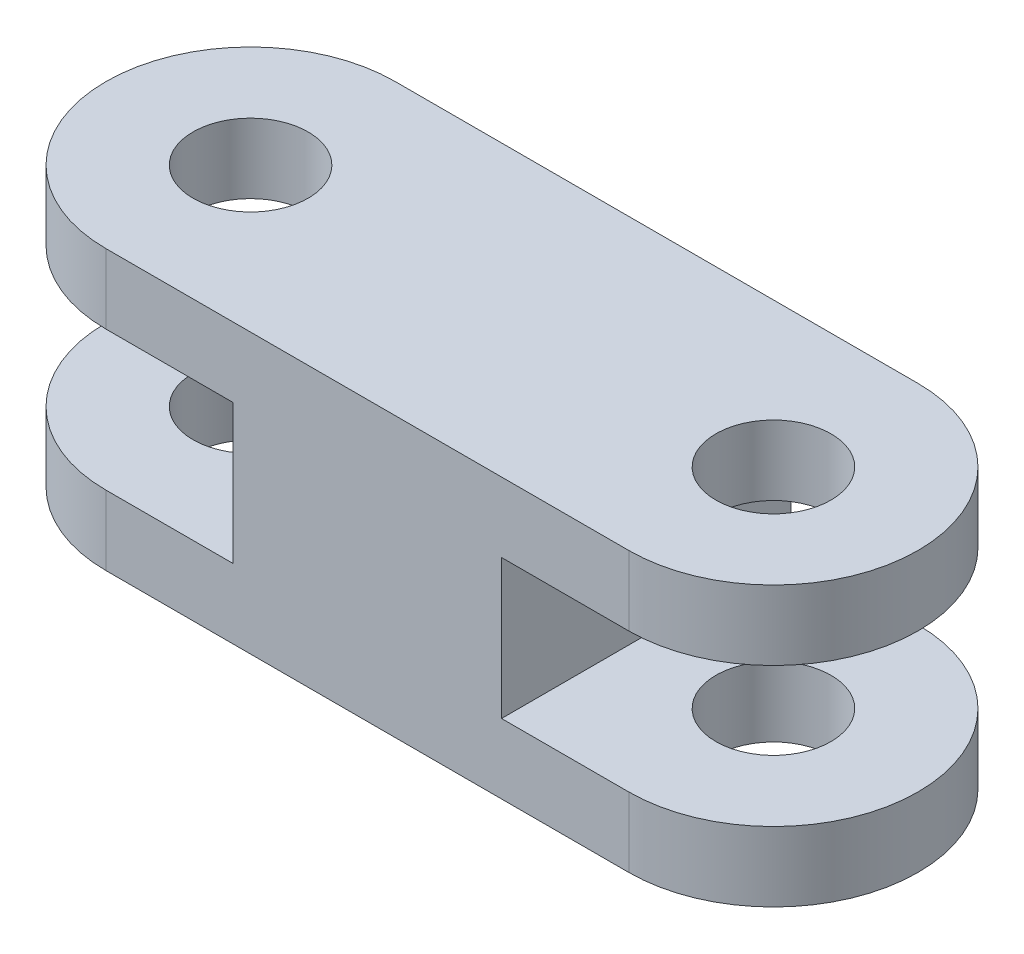
ISO-10303-21;
HEADER;
FILE_DESCRIPTION(('STEP AP214'),'2;1');
FILE_NAME('part.step','',(''),(''),'','','');
FILE_SCHEMA(('AUTOMOTIVE_DESIGN { 1 0 10303 214 1 1 1 1 }'));
ENDSEC;
DATA;
#1=APPLICATION_CONTEXT('core data for automotive mechanical design processes');
#2=APPLICATION_PROTOCOL_DEFINITION('international standard','automotive_design',2000,#1);
#3=PRODUCT_CONTEXT('',#1,'mechanical');
#4=PRODUCT('Part','Part','',(#3));
#5=PRODUCT_RELATED_PRODUCT_CATEGORY('part','',(#4));
#6=PRODUCT_DEFINITION_FORMATION('','',#4);
#7=PRODUCT_DEFINITION_CONTEXT('part definition',#1,'design');
#8=PRODUCT_DEFINITION('design','',#6,#7);
#9=PRODUCT_DEFINITION_SHAPE('','',#8);
#10=(LENGTH_UNIT() NAMED_UNIT(*) SI_UNIT(.MILLI.,.METRE.));
#11=(NAMED_UNIT(*) PLANE_ANGLE_UNIT() SI_UNIT($,.RADIAN.));
#12=(NAMED_UNIT(*) SI_UNIT($,.STERADIAN.) SOLID_ANGLE_UNIT());
#13=UNCERTAINTY_MEASURE_WITH_UNIT(LENGTH_MEASURE(1.E-05),#10,'distance_accuracy_value','');
#14=(GEOMETRIC_REPRESENTATION_CONTEXT(3) GLOBAL_UNCERTAINTY_ASSIGNED_CONTEXT((#13)) GLOBAL_UNIT_ASSIGNED_CONTEXT((#10,
#11,#12)) REPRESENTATION_CONTEXT('',''));
#15=CARTESIAN_POINT('',(0.,0.,0.));
#16=DIRECTION('',(0.,0.,1.));
#17=DIRECTION('',(1.,0.,0.));
#18=AXIS2_PLACEMENT_3D('',#15,#16,#17);
#19=CARTESIAN_POINT('',(-7.5,2.,0.));
#20=DIRECTION('',(0.,1.,0.));
#21=DIRECTION('',(0.,0.,1.));
#22=AXIS2_PLACEMENT_3D('',#19,#20,#21);
#23=PLANE('',#22);
#24=DIRECTION('',(0.,0.,1.));
#25=VECTOR('',#24,1.);
#26=CARTESIAN_POINT('',(-3.85,2.,4.15));
#27=LINE('',#26,#25);
#28=CARTESIAN_POINT('',(-3.85,2.,-4.15));
#29=VERTEX_POINT('',#28);
#30=CARTESIAN_POINT('',(-3.85,2.,4.15));
#31=VERTEX_POINT('',#30);
#32=EDGE_CURVE('E55',#29,#31,#27,.T.);
#33=ORIENTED_EDGE('',*,*,#32,.F.);
#34=DIRECTION('',(-1.,0.,0.));
#35=VECTOR('',#34,1.);
#36=CARTESIAN_POINT('',(-7.5,2.,-4.15));
#37=LINE('',#36,#35);
#38=CARTESIAN_POINT('',(-7.5,2.,-4.15));
#39=VERTEX_POINT('',#38);
#40=EDGE_CURVE('E260',#29,#39,#37,.T.);
#41=ORIENTED_EDGE('',*,*,#40,.T.);
#42=CARTESIAN_POINT('',(-7.5,2.,0.));
#43=DIRECTION('',(0.,1.,0.));
#44=DIRECTION('',(0.,0.,1.));
#45=AXIS2_PLACEMENT_3D('',#42,#43,#44);
#46=CIRCLE('',#45,4.15);
#47=CARTESIAN_POINT('',(-7.5,2.,4.15));
#48=VERTEX_POINT('',#47);
#49=EDGE_CURVE('E248',#39,#48,#46,.T.);
#50=ORIENTED_EDGE('',*,*,#49,.T.);
#51=DIRECTION('',(1.,0.,0.));
#52=VECTOR('',#51,1.);
#53=CARTESIAN_POINT('',(-7.5,2.,4.15));
#54=LINE('',#53,#52);
#55=EDGE_CURVE('E254',#48,#31,#54,.T.);
#56=ORIENTED_EDGE('',*,*,#55,.T.);
#57=EDGE_LOOP('',(#33,#41,#50,#56));
#58=FACE_BOUND('',#57,.T.);
#59=CARTESIAN_POINT('',(-7.5,2.,0.));
#60=DIRECTION('',(0.,1.,0.));
#61=DIRECTION('',(0.,0.,1.));
#62=AXIS2_PLACEMENT_3D('',#59,#60,#61);
#63=CIRCLE('',#62,1.65);
#64=CARTESIAN_POINT('',(-7.5,2.,1.65));
#65=VERTEX_POINT('',#64);
#66=EDGE_CURVE('E240',#65,#65,#63,.T.);
#67=ORIENTED_EDGE('',*,*,#66,.F.);
#68=EDGE_LOOP('',(#67));
#69=FACE_BOUND('',#68,.T.);
#70=ADVANCED_FACE('F39',(#58,#69),#23,.T.);
#71=DIRECTION('',(0.,0.,-1.));
#72=VECTOR('',#71,1.);
#73=CARTESIAN_POINT('',(3.85,2.,4.15));
#74=LINE('',#73,#72);
#75=CARTESIAN_POINT('',(3.85,2.,4.15));
#76=VERTEX_POINT('',#75);
#77=CARTESIAN_POINT('',(3.85,2.,-4.15));
#78=VERTEX_POINT('',#77);
#79=EDGE_CURVE('E63',#76,#78,#74,.T.);
#80=ORIENTED_EDGE('',*,*,#79,.F.);
#81=CARTESIAN_POINT('',(7.5,2.,4.15));
#82=VERTEX_POINT('',#81);
#83=EDGE_CURVE('E252',#76,#82,#54,.T.);
#84=ORIENTED_EDGE('',*,*,#83,.T.);
#85=CARTESIAN_POINT('',(7.5,2.,0.));
#86=DIRECTION('',(0.,1.,0.));
#87=DIRECTION('',(0.,0.,1.));
#88=AXIS2_PLACEMENT_3D('',#85,#86,#87);
#89=CIRCLE('',#88,4.15);
#90=CARTESIAN_POINT('',(7.5,2.,-4.15));
#91=VERTEX_POINT('',#90);
#92=EDGE_CURVE('E257',#82,#91,#89,.T.);
#93=ORIENTED_EDGE('',*,*,#92,.T.);
#94=EDGE_CURVE('E261',#91,#78,#37,.T.);
#95=ORIENTED_EDGE('',*,*,#94,.T.);
#96=EDGE_LOOP('',(#80,#84,#93,#95));
#97=FACE_BOUND('',#96,.T.);
#98=CARTESIAN_POINT('',(7.5,2.,0.));
#99=DIRECTION('',(0.,1.,0.));
#100=DIRECTION('',(0.,0.,1.));
#101=AXIS2_PLACEMENT_3D('',#98,#99,#100);
#102=CIRCLE('',#101,1.65);
#103=CARTESIAN_POINT('',(7.5,2.,1.65));
#104=VERTEX_POINT('',#103);
#105=EDGE_CURVE('E232',#104,#104,#102,.T.);
#106=ORIENTED_EDGE('',*,*,#105,.F.);
#107=EDGE_LOOP('',(#106));
#108=FACE_BOUND('',#107,.T.);
#109=ADVANCED_FACE('F338',(#97,#108),#23,.T.);
#110=CARTESIAN_POINT('',(-7.5,0.,0.));
#111=DIRECTION('',(0.,1.,0.));
#112=DIRECTION('',(0.,0.,1.));
#113=AXIS2_PLACEMENT_3D('',#110,#111,#112);
#114=PLANE('',#113);
#115=CARTESIAN_POINT('',(-7.5,0.,0.));
#116=DIRECTION('',(0.,1.,0.));
#117=DIRECTION('',(0.,0.,1.));
#118=AXIS2_PLACEMENT_3D('',#115,#116,#117);
#119=CIRCLE('',#118,4.15);
#120=CARTESIAN_POINT('',(-7.5,0.,-4.15));
#121=VERTEX_POINT('',#120);
#122=CARTESIAN_POINT('',(-7.5,0.,4.15));
#123=VERTEX_POINT('',#122);
#124=EDGE_CURVE('E244',#121,#123,#119,.T.);
#125=ORIENTED_EDGE('',*,*,#124,.F.);
#126=DIRECTION('',(-1.,0.,0.));
#127=VECTOR('',#126,1.);
#128=CARTESIAN_POINT('',(-7.5,0.,-4.15));
#129=LINE('',#128,#127);
#130=CARTESIAN_POINT('',(7.5,0.,-4.15));
#131=VERTEX_POINT('',#130);
#132=EDGE_CURVE('E253',#131,#121,#129,.T.);
#133=ORIENTED_EDGE('',*,*,#132,.F.);
#134=CARTESIAN_POINT('',(7.5,0.,0.));
#135=DIRECTION('',(0.,1.,0.));
#136=DIRECTION('',(0.,0.,1.));
#137=AXIS2_PLACEMENT_3D('',#134,#135,#136);
#138=CIRCLE('',#137,4.15);
#139=CARTESIAN_POINT('',(7.5,0.,4.15));
#140=VERTEX_POINT('',#139);
#141=EDGE_CURVE('E271',#140,#131,#138,.T.);
#142=ORIENTED_EDGE('',*,*,#141,.F.);
#143=DIRECTION('',(1.,0.,0.));
#144=VECTOR('',#143,1.);
#145=CARTESIAN_POINT('',(-7.5,0.,4.15));
#146=LINE('',#145,#144);
#147=EDGE_CURVE('E268',#123,#140,#146,.T.);
#148=ORIENTED_EDGE('',*,*,#147,.F.);
#149=EDGE_LOOP('',(#125,#133,#142,#148));
#150=FACE_BOUND('',#149,.T.);
#151=CARTESIAN_POINT('',(-7.5,0.,0.));
#152=DIRECTION('',(0.,1.,0.));
#153=DIRECTION('',(0.,0.,1.));
#154=AXIS2_PLACEMENT_3D('',#151,#152,#153);
#155=CIRCLE('',#154,1.65);
#156=CARTESIAN_POINT('',(-7.5,0.,1.65));
#157=VERTEX_POINT('',#156);
#158=EDGE_CURVE('E236',#157,#157,#155,.T.);
#159=ORIENTED_EDGE('',*,*,#158,.T.);
#160=EDGE_LOOP('',(#159));
#161=FACE_BOUND('',#160,.T.);
#162=CARTESIAN_POINT('',(7.5,0.,0.));
#163=DIRECTION('',(0.,1.,0.));
#164=DIRECTION('',(0.,0.,1.));
#165=AXIS2_PLACEMENT_3D('',#162,#163,#164);
#166=CIRCLE('',#165,1.65);
#167=CARTESIAN_POINT('',(7.5,0.,1.65));
#168=VERTEX_POINT('',#167);
#169=EDGE_CURVE('E231',#168,#168,#166,.T.);
#170=ORIENTED_EDGE('',*,*,#169,.T.);
#171=EDGE_LOOP('',(#170));
#172=FACE_BOUND('',#171,.T.);
#173=ADVANCED_FACE('F294',(#150,#161,#172),#114,.F.);
#174=CARTESIAN_POINT('',(-7.5,2.,0.));
#175=DIRECTION('',(0.,-1.,0.));
#176=DIRECTION('',(0.,0.,-1.));
#177=AXIS2_PLACEMENT_3D('',#174,#175,#176);
#178=CYLINDRICAL_SURFACE('',#177,4.15);
#179=ORIENTED_EDGE('',*,*,#124,.T.);
#180=DIRECTION('',(0.,-1.,0.));
#181=VECTOR('',#180,1.);
#182=CARTESIAN_POINT('',(-7.5,2.,4.15));
#183=LINE('',#182,#181);
#184=EDGE_CURVE('E11',#48,#123,#183,.T.);
#185=ORIENTED_EDGE('',*,*,#184,.F.);
#186=ORIENTED_EDGE('',*,*,#49,.F.);
#187=DIRECTION('',(0.,-1.,0.));
#188=VECTOR('',#187,1.);
#189=CARTESIAN_POINT('',(-7.5,2.,-4.15));
#190=LINE('',#189,#188);
#191=EDGE_CURVE('E264',#39,#121,#190,.T.);
#192=ORIENTED_EDGE('',*,*,#191,.T.);
#193=EDGE_LOOP('',(#179,#185,#186,#192));
#194=FACE_BOUND('',#193,.T.);
#195=ADVANCED_FACE('F41',(#194),#178,.T.);
#196=CARTESIAN_POINT('',(-7.5,2.,4.15));
#197=DIRECTION('',(0.,0.,-1.));
#198=DIRECTION('',(-1.,0.,0.));
#199=AXIS2_PLACEMENT_3D('',#196,#197,#198);
#200=PLANE('',#199);
#201=ORIENTED_EDGE('',*,*,#147,.T.);
#202=DIRECTION('',(0.,-1.,0.));
#203=VECTOR('',#202,1.);
#204=CARTESIAN_POINT('',(7.5,2.,4.15));
#205=LINE('',#204,#203);
#206=EDGE_CURVE('E48',#82,#140,#205,.T.);
#207=ORIENTED_EDGE('',*,*,#206,.F.);
#208=ORIENTED_EDGE('',*,*,#83,.F.);
#209=DIRECTION('',(0.,-1.,0.));
#210=VECTOR('',#209,1.);
#211=CARTESIAN_POINT('',(3.85,3.,4.15));
#212=LINE('',#211,#210);
#213=CARTESIAN_POINT('',(3.85,6.,4.15));
#214=VERTEX_POINT('',#213);
#215=EDGE_CURVE('E138',#214,#76,#212,.T.);
#216=ORIENTED_EDGE('',*,*,#215,.F.);
#217=DIRECTION('',(1.,0.,0.));
#218=VECTOR('',#217,1.);
#219=CARTESIAN_POINT('',(-7.5,6.,4.15));
#220=LINE('',#219,#218);
#221=CARTESIAN_POINT('',(7.5,6.,4.15));
#222=VERTEX_POINT('',#221);
#223=EDGE_CURVE('E157',#214,#222,#220,.T.);
#224=ORIENTED_EDGE('',*,*,#223,.T.);
#225=DIRECTION('',(0.,1.,0.));
#226=VECTOR('',#225,1.);
#227=CARTESIAN_POINT('',(7.5,6.,4.15));
#228=LINE('',#227,#226);
#229=CARTESIAN_POINT('',(7.5,8.,4.15));
#230=VERTEX_POINT('',#229);
#231=EDGE_CURVE('E212',#222,#230,#228,.T.);
#232=ORIENTED_EDGE('',*,*,#231,.T.);
#233=DIRECTION('',(1.,0.,0.));
#234=VECTOR('',#233,1.);
#235=CARTESIAN_POINT('',(-7.5,8.,4.15));
#236=LINE('',#235,#234);
#237=CARTESIAN_POINT('',(-7.5,8.,4.15));
#238=VERTEX_POINT('',#237);
#239=EDGE_CURVE('E197',#238,#230,#236,.T.);
#240=ORIENTED_EDGE('',*,*,#239,.F.);
#241=DIRECTION('',(0.,1.,0.));
#242=VECTOR('',#241,1.);
#243=CARTESIAN_POINT('',(-7.5,6.,4.15));
#244=LINE('',#243,#242);
#245=CARTESIAN_POINT('',(-7.5,6.,4.15));
#246=VERTEX_POINT('',#245);
#247=EDGE_CURVE('E215',#246,#238,#244,.T.);
#248=ORIENTED_EDGE('',*,*,#247,.F.);
#249=CARTESIAN_POINT('',(-3.85,6.,4.15));
#250=VERTEX_POINT('',#249);
#251=EDGE_CURVE('E187',#246,#250,#220,.T.);
#252=ORIENTED_EDGE('',*,*,#251,.T.);
#253=DIRECTION('',(0.,-1.,0.));
#254=VECTOR('',#253,1.);
#255=CARTESIAN_POINT('',(-3.85,3.,4.15));
#256=LINE('',#255,#254);
#257=EDGE_CURVE('E227',#250,#31,#256,.T.);
#258=ORIENTED_EDGE('',*,*,#257,.T.);
#259=ORIENTED_EDGE('',*,*,#55,.F.);
#260=ORIENTED_EDGE('',*,*,#184,.T.);
#261=EDGE_LOOP('',(#201,#207,#208,#216,#224,#232,#240,#248,#252,#258,#259,#260));
#262=FACE_BOUND('',#261,.T.);
#263=ADVANCED_FACE('F306',(#262),#200,.F.);
#264=CARTESIAN_POINT('',(7.5,2.,0.));
#265=DIRECTION('',(0.,-1.,0.));
#266=DIRECTION('',(0.,0.,-1.));
#267=AXIS2_PLACEMENT_3D('',#264,#265,#266);
#268=CYLINDRICAL_SURFACE('',#267,4.15);
#269=ORIENTED_EDGE('',*,*,#141,.T.);
#270=DIRECTION('',(0.,-1.,0.));
#271=VECTOR('',#270,1.);
#272=CARTESIAN_POINT('',(7.5,2.,-4.15));
#273=LINE('',#272,#271);
#274=EDGE_CURVE('E279',#91,#131,#273,.T.);
#275=ORIENTED_EDGE('',*,*,#274,.F.);
#276=ORIENTED_EDGE('',*,*,#92,.F.);
#277=ORIENTED_EDGE('',*,*,#206,.T.);
#278=EDGE_LOOP('',(#269,#275,#276,#277));
#279=FACE_BOUND('',#278,.T.);
#280=ADVANCED_FACE('F288',(#279),#268,.T.);
#281=CARTESIAN_POINT('',(-7.5,2.,-4.15));
#282=DIRECTION('',(0.,0.,1.));
#283=DIRECTION('',(1.,0.,0.));
#284=AXIS2_PLACEMENT_3D('',#281,#282,#283);
#285=PLANE('',#284);
#286=ORIENTED_EDGE('',*,*,#132,.T.);
#287=ORIENTED_EDGE('',*,*,#191,.F.);
#288=ORIENTED_EDGE('',*,*,#40,.F.);
#289=DIRECTION('',(0.,-1.,0.));
#290=VECTOR('',#289,1.);
#291=CARTESIAN_POINT('',(-3.85,3.,-4.15));
#292=LINE('',#291,#290);
#293=CARTESIAN_POINT('',(-3.85,6.,-4.15));
#294=VERTEX_POINT('',#293);
#295=EDGE_CURVE('E139',#294,#29,#292,.T.);
#296=ORIENTED_EDGE('',*,*,#295,.F.);
#297=DIRECTION('',(-1.,0.,0.));
#298=VECTOR('',#297,1.);
#299=CARTESIAN_POINT('',(-7.5,6.,-4.15));
#300=LINE('',#299,#298);
#301=CARTESIAN_POINT('',(-7.5,6.,-4.15));
#302=VERTEX_POINT('',#301);
#303=EDGE_CURVE('E151',#294,#302,#300,.T.);
#304=ORIENTED_EDGE('',*,*,#303,.T.);
#305=DIRECTION('',(0.,1.,0.));
#306=VECTOR('',#305,1.);
#307=CARTESIAN_POINT('',(-7.5,6.,-4.15));
#308=LINE('',#307,#306);
#309=CARTESIAN_POINT('',(-7.5,8.,-4.15));
#310=VERTEX_POINT('',#309);
#311=EDGE_CURVE('E150',#302,#310,#308,.T.);
#312=ORIENTED_EDGE('',*,*,#311,.T.);
#313=DIRECTION('',(-1.,0.,0.));
#314=VECTOR('',#313,1.);
#315=CARTESIAN_POINT('',(-7.5,8.,-4.15));
#316=LINE('',#315,#314);
#317=CARTESIAN_POINT('',(7.5,8.,-4.15));
#318=VERTEX_POINT('',#317);
#319=EDGE_CURVE('E186',#318,#310,#316,.T.);
#320=ORIENTED_EDGE('',*,*,#319,.F.);
#321=DIRECTION('',(0.,1.,0.));
#322=VECTOR('',#321,1.);
#323=CARTESIAN_POINT('',(7.5,6.,-4.15));
#324=LINE('',#323,#322);
#325=CARTESIAN_POINT('',(7.5,6.,-4.15));
#326=VERTEX_POINT('',#325);
#327=EDGE_CURVE('E145',#326,#318,#324,.T.);
#328=ORIENTED_EDGE('',*,*,#327,.F.);
#329=CARTESIAN_POINT('',(3.85,6.,-4.15));
#330=VERTEX_POINT('',#329);
#331=EDGE_CURVE('E142',#326,#330,#300,.T.);
#332=ORIENTED_EDGE('',*,*,#331,.T.);
#333=DIRECTION('',(0.,-1.,0.));
#334=VECTOR('',#333,1.);
#335=CARTESIAN_POINT('',(3.85,3.,-4.15));
#336=LINE('',#335,#334);
#337=EDGE_CURVE('E129',#330,#78,#336,.T.);
#338=ORIENTED_EDGE('',*,*,#337,.T.);
#339=ORIENTED_EDGE('',*,*,#94,.F.);
#340=ORIENTED_EDGE('',*,*,#274,.T.);
#341=EDGE_LOOP('',(#286,#287,#288,#296,#304,#312,#320,#328,#332,#338,#339,#340));
#342=FACE_BOUND('',#341,.T.);
#343=ADVANCED_FACE('F143',(#342),#285,.F.);
#344=CARTESIAN_POINT('',(-7.5,2.,0.));
#345=DIRECTION('',(0.,-1.,0.));
#346=DIRECTION('',(0.,0.,-1.));
#347=AXIS2_PLACEMENT_3D('',#344,#345,#346);
#348=CYLINDRICAL_SURFACE('',#347,1.65);
#349=ORIENTED_EDGE('',*,*,#66,.T.);
#350=EDGE_LOOP('',(#349));
#351=FACE_BOUND('',#350,.T.);
#352=ORIENTED_EDGE('',*,*,#158,.F.);
#353=EDGE_LOOP('',(#352));
#354=FACE_BOUND('',#353,.T.);
#355=ADVANCED_FACE('F334',(#351,#354),#348,.F.);
#356=CARTESIAN_POINT('',(7.5,2.,0.));
#357=DIRECTION('',(0.,-1.,0.));
#358=DIRECTION('',(0.,0.,-1.));
#359=AXIS2_PLACEMENT_3D('',#356,#357,#358);
#360=CYLINDRICAL_SURFACE('',#359,1.65);
#361=ORIENTED_EDGE('',*,*,#105,.T.);
#362=EDGE_LOOP('',(#361));
#363=FACE_BOUND('',#362,.T.);
#364=ORIENTED_EDGE('',*,*,#169,.F.);
#365=EDGE_LOOP('',(#364));
#366=FACE_BOUND('',#365,.T.);
#367=ADVANCED_FACE('F327',(#363,#366),#360,.F.);
#368=CARTESIAN_POINT('',(-3.85,3.,4.15));
#369=DIRECTION('',(1.,0.,0.));
#370=DIRECTION('',(0.,0.,-1.));
#371=AXIS2_PLACEMENT_3D('',#368,#369,#370);
#372=PLANE('',#371);
#373=ORIENTED_EDGE('',*,*,#32,.T.);
#374=ORIENTED_EDGE('',*,*,#257,.F.);
#375=DIRECTION('',(0.,0.,1.));
#376=VECTOR('',#375,1.);
#377=CARTESIAN_POINT('',(-3.85,6.,4.15));
#378=LINE('',#377,#376);
#379=EDGE_CURVE('E160',#294,#250,#378,.T.);
#380=ORIENTED_EDGE('',*,*,#379,.F.);
#381=ORIENTED_EDGE('',*,*,#295,.T.);
#382=EDGE_LOOP('',(#373,#374,#380,#381));
#383=FACE_BOUND('',#382,.T.);
#384=ADVANCED_FACE('F325',(#383),#372,.F.);
#385=CARTESIAN_POINT('',(3.85,3.,4.15));
#386=DIRECTION('',(-1.,0.,0.));
#387=DIRECTION('',(0.,0.,1.));
#388=AXIS2_PLACEMENT_3D('',#385,#386,#387);
#389=PLANE('',#388);
#390=ORIENTED_EDGE('',*,*,#79,.T.);
#391=ORIENTED_EDGE('',*,*,#337,.F.);
#392=DIRECTION('',(0.,0.,-1.));
#393=VECTOR('',#392,1.);
#394=CARTESIAN_POINT('',(3.85,6.,4.15));
#395=LINE('',#394,#393);
#396=EDGE_CURVE('E134',#214,#330,#395,.T.);
#397=ORIENTED_EDGE('',*,*,#396,.F.);
#398=ORIENTED_EDGE('',*,*,#215,.T.);
#399=EDGE_LOOP('',(#390,#391,#397,#398));
#400=FACE_BOUND('',#399,.T.);
#401=ADVANCED_FACE('F131',(#400),#389,.F.);
#402=CARTESIAN_POINT('',(-7.5,6.,0.));
#403=DIRECTION('',(0.,-1.,0.));
#404=DIRECTION('',(0.,0.,1.));
#405=AXIS2_PLACEMENT_3D('',#402,#403,#404);
#406=PLANE('',#405);
#407=ORIENTED_EDGE('',*,*,#379,.T.);
#408=ORIENTED_EDGE('',*,*,#251,.F.);
#409=CARTESIAN_POINT('',(-7.5,6.,0.));
#410=DIRECTION('',(0.,1.,0.));
#411=DIRECTION('',(0.,0.,1.));
#412=AXIS2_PLACEMENT_3D('',#409,#410,#411);
#413=CIRCLE('',#412,4.15);
#414=EDGE_CURVE('E182',#302,#246,#413,.T.);
#415=ORIENTED_EDGE('',*,*,#414,.F.);
#416=ORIENTED_EDGE('',*,*,#303,.F.);
#417=EDGE_LOOP('',(#407,#408,#415,#416));
#418=FACE_BOUND('',#417,.T.);
#419=CARTESIAN_POINT('',(-7.5,6.,0.));
#420=DIRECTION('',(0.,1.,0.));
#421=DIRECTION('',(0.,0.,1.));
#422=AXIS2_PLACEMENT_3D('',#419,#420,#421);
#423=CIRCLE('',#422,1.65);
#424=CARTESIAN_POINT('',(-7.5,6.,1.65));
#425=VERTEX_POINT('',#424);
#426=EDGE_CURVE('E174',#425,#425,#423,.T.);
#427=ORIENTED_EDGE('',*,*,#426,.T.);
#428=EDGE_LOOP('',(#427));
#429=FACE_BOUND('',#428,.T.);
#430=ADVANCED_FACE('F321',(#418,#429),#406,.T.);
#431=ORIENTED_EDGE('',*,*,#396,.T.);
#432=ORIENTED_EDGE('',*,*,#331,.F.);
#433=CARTESIAN_POINT('',(7.5,6.,0.));
#434=DIRECTION('',(0.,1.,0.));
#435=DIRECTION('',(0.,0.,1.));
#436=AXIS2_PLACEMENT_3D('',#433,#434,#435);
#437=CIRCLE('',#436,4.15);
#438=EDGE_CURVE('E191',#222,#326,#437,.T.);
#439=ORIENTED_EDGE('',*,*,#438,.F.);
#440=ORIENTED_EDGE('',*,*,#223,.F.);
#441=EDGE_LOOP('',(#431,#432,#439,#440));
#442=FACE_BOUND('',#441,.T.);
#443=CARTESIAN_POINT('',(7.5,6.,0.));
#444=DIRECTION('',(0.,1.,0.));
#445=DIRECTION('',(0.,0.,1.));
#446=AXIS2_PLACEMENT_3D('',#443,#444,#445);
#447=CIRCLE('',#446,1.65);
#448=CARTESIAN_POINT('',(7.5,6.,1.65));
#449=VERTEX_POINT('',#448);
#450=EDGE_CURVE('E165',#449,#449,#447,.T.);
#451=ORIENTED_EDGE('',*,*,#450,.T.);
#452=EDGE_LOOP('',(#451));
#453=FACE_BOUND('',#452,.T.);
#454=ADVANCED_FACE('F154',(#442,#453),#406,.T.);
#455=CARTESIAN_POINT('',(-7.5,8.,0.));
#456=DIRECTION('',(0.,-1.,0.));
#457=DIRECTION('',(0.,0.,1.));
#458=AXIS2_PLACEMENT_3D('',#455,#456,#457);
#459=PLANE('',#458);
#460=CARTESIAN_POINT('',(-7.5,8.,0.));
#461=DIRECTION('',(0.,1.,0.));
#462=DIRECTION('',(0.,0.,1.));
#463=AXIS2_PLACEMENT_3D('',#460,#461,#462);
#464=CIRCLE('',#463,4.15);
#465=EDGE_CURVE('E178',#310,#238,#464,.T.);
#466=ORIENTED_EDGE('',*,*,#465,.T.);
#467=ORIENTED_EDGE('',*,*,#239,.T.);
#468=CARTESIAN_POINT('',(7.5,8.,0.));
#469=DIRECTION('',(0.,1.,0.));
#470=DIRECTION('',(0.,0.,1.));
#471=AXIS2_PLACEMENT_3D('',#468,#469,#470);
#472=CIRCLE('',#471,4.15);
#473=EDGE_CURVE('E201',#230,#318,#472,.T.);
#474=ORIENTED_EDGE('',*,*,#473,.T.);
#475=ORIENTED_EDGE('',*,*,#319,.T.);
#476=EDGE_LOOP('',(#466,#467,#474,#475));
#477=FACE_BOUND('',#476,.T.);
#478=CARTESIAN_POINT('',(-7.5,8.,0.));
#479=DIRECTION('',(0.,1.,0.));
#480=DIRECTION('',(0.,0.,1.));
#481=AXIS2_PLACEMENT_3D('',#478,#479,#480);
#482=CIRCLE('',#481,1.65);
#483=CARTESIAN_POINT('',(-7.5,8.,1.65));
#484=VERTEX_POINT('',#483);
#485=EDGE_CURVE('E172',#484,#484,#482,.T.);
#486=ORIENTED_EDGE('',*,*,#485,.F.);
#487=EDGE_LOOP('',(#486));
#488=FACE_BOUND('',#487,.T.);
#489=CARTESIAN_POINT('',(7.5,8.,0.));
#490=DIRECTION('',(0.,1.,0.));
#491=DIRECTION('',(0.,0.,1.));
#492=AXIS2_PLACEMENT_3D('',#489,#490,#491);
#493=CIRCLE('',#492,1.65);
#494=CARTESIAN_POINT('',(7.5,8.,1.65));
#495=VERTEX_POINT('',#494);
#496=EDGE_CURVE('E159',#495,#495,#493,.T.);
#497=ORIENTED_EDGE('',*,*,#496,.F.);
#498=EDGE_LOOP('',(#497));
#499=FACE_BOUND('',#498,.T.);
#500=ADVANCED_FACE('F312',(#477,#488,#499),#459,.F.);
#501=CARTESIAN_POINT('',(-7.5,6.,0.));
#502=DIRECTION('',(0.,1.,0.));
#503=DIRECTION('',(0.,0.,-1.));
#504=AXIS2_PLACEMENT_3D('',#501,#502,#503);
#505=CYLINDRICAL_SURFACE('',#504,4.15);
#506=ORIENTED_EDGE('',*,*,#465,.F.);
#507=ORIENTED_EDGE('',*,*,#311,.F.);
#508=ORIENTED_EDGE('',*,*,#414,.T.);
#509=ORIENTED_EDGE('',*,*,#247,.T.);
#510=EDGE_LOOP('',(#506,#507,#508,#509));
#511=FACE_BOUND('',#510,.T.);
#512=ADVANCED_FACE('F318',(#511),#505,.T.);
#513=CARTESIAN_POINT('',(7.5,6.,0.));
#514=DIRECTION('',(0.,1.,0.));
#515=DIRECTION('',(0.,0.,-1.));
#516=AXIS2_PLACEMENT_3D('',#513,#514,#515);
#517=CYLINDRICAL_SURFACE('',#516,4.15);
#518=ORIENTED_EDGE('',*,*,#473,.F.);
#519=ORIENTED_EDGE('',*,*,#231,.F.);
#520=ORIENTED_EDGE('',*,*,#438,.T.);
#521=ORIENTED_EDGE('',*,*,#327,.T.);
#522=EDGE_LOOP('',(#518,#519,#520,#521));
#523=FACE_BOUND('',#522,.T.);
#524=ADVANCED_FACE('F310',(#523),#517,.T.);
#525=CARTESIAN_POINT('',(-7.5,6.,0.));
#526=DIRECTION('',(0.,1.,0.));
#527=DIRECTION('',(0.,0.,-1.));
#528=AXIS2_PLACEMENT_3D('',#525,#526,#527);
#529=CYLINDRICAL_SURFACE('',#528,1.65);
#530=ORIENTED_EDGE('',*,*,#426,.F.);
#531=EDGE_LOOP('',(#530));
#532=FACE_BOUND('',#531,.T.);
#533=ORIENTED_EDGE('',*,*,#485,.T.);
#534=EDGE_LOOP('',(#533));
#535=FACE_BOUND('',#534,.T.);
#536=ADVANCED_FACE('F481',(#532,#535),#529,.F.);
#537=CARTESIAN_POINT('',(7.5,6.,0.));
#538=DIRECTION('',(0.,1.,0.));
#539=DIRECTION('',(0.,0.,-1.));
#540=AXIS2_PLACEMENT_3D('',#537,#538,#539);
#541=CYLINDRICAL_SURFACE('',#540,1.65);
#542=ORIENTED_EDGE('',*,*,#450,.F.);
#543=EDGE_LOOP('',(#542));
#544=FACE_BOUND('',#543,.T.);
#545=ORIENTED_EDGE('',*,*,#496,.T.);
#546=EDGE_LOOP('',(#545));
#547=FACE_BOUND('',#546,.T.);
#548=ADVANCED_FACE('F489',(#544,#547),#541,.F.);
#549=CLOSED_SHELL('',(#70,#109,#173,#195,#263,#280,#343,#355,#367,#384,#401,#430,#454,#500,#512,
#524,#536,#548));
#550=MANIFOLD_SOLID_BREP('B2',#549);
#551=ADVANCED_BREP_SHAPE_REPRESENTATION('',(#18,#550),#14);
#552=SHAPE_DEFINITION_REPRESENTATION(#9,#551);
ENDSEC;
END-ISO-10303-21;
